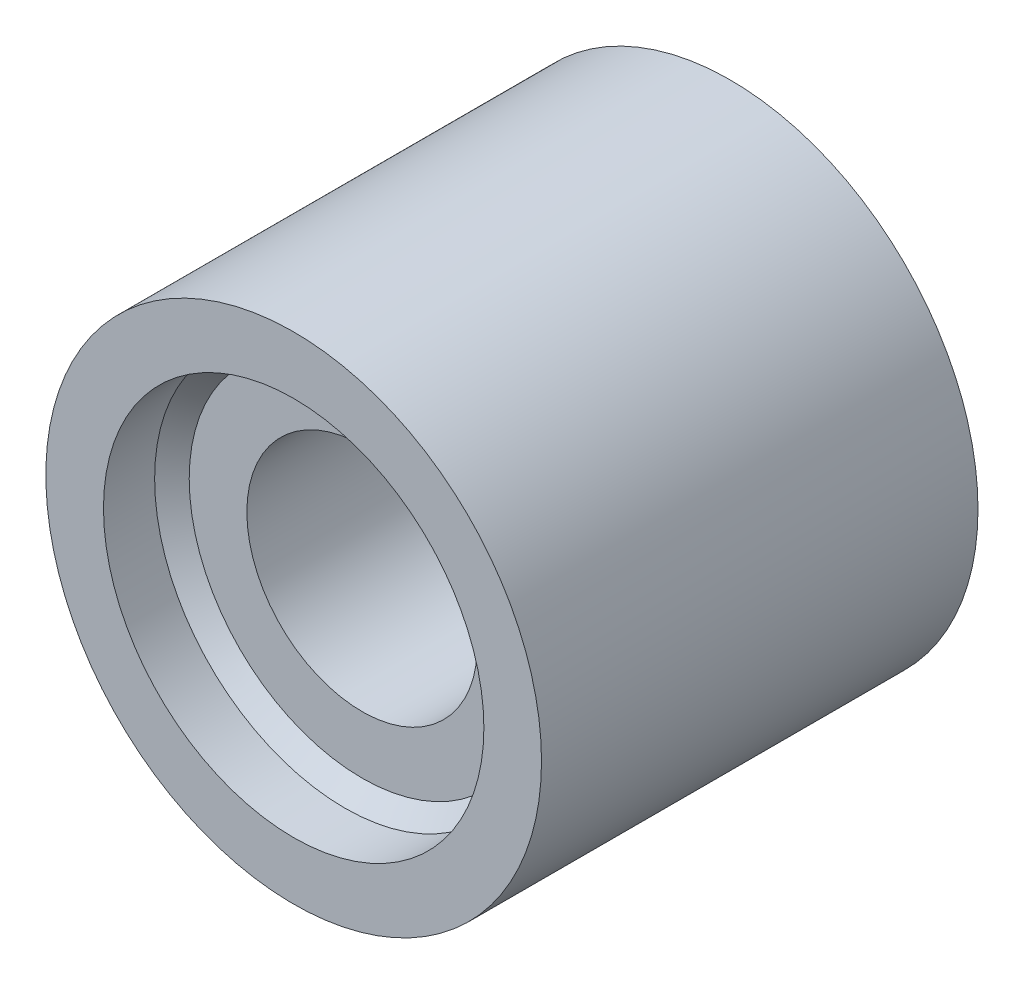
ISO-10303-21;
HEADER;
FILE_DESCRIPTION(('STEP AP214'),'2;1');
FILE_NAME('part.step','',(''),(''),'','','');
FILE_SCHEMA(('AUTOMOTIVE_DESIGN { 1 0 10303 214 1 1 1 1 }'));
ENDSEC;
DATA;
#1=APPLICATION_CONTEXT('core data for automotive mechanical design processes');
#2=APPLICATION_PROTOCOL_DEFINITION('international standard','automotive_design',2000,#1);
#3=PRODUCT_CONTEXT('',#1,'mechanical');
#4=PRODUCT('Part','Part','',(#3));
#5=PRODUCT_RELATED_PRODUCT_CATEGORY('part','',(#4));
#6=PRODUCT_DEFINITION_FORMATION('','',#4);
#7=PRODUCT_DEFINITION_CONTEXT('part definition',#1,'design');
#8=PRODUCT_DEFINITION('design','',#6,#7);
#9=PRODUCT_DEFINITION_SHAPE('','',#8);
#10=(LENGTH_UNIT() NAMED_UNIT(*) SI_UNIT(.MILLI.,.METRE.));
#11=(NAMED_UNIT(*) PLANE_ANGLE_UNIT() SI_UNIT($,.RADIAN.));
#12=(NAMED_UNIT(*) SI_UNIT($,.STERADIAN.) SOLID_ANGLE_UNIT());
#13=UNCERTAINTY_MEASURE_WITH_UNIT(LENGTH_MEASURE(1.E-05),#10,'distance_accuracy_value','');
#14=(GEOMETRIC_REPRESENTATION_CONTEXT(3) GLOBAL_UNCERTAINTY_ASSIGNED_CONTEXT((#13)) GLOBAL_UNIT_ASSIGNED_CONTEXT((#10,
#11,#12)) REPRESENTATION_CONTEXT('',''));
#15=CARTESIAN_POINT('',(0.,0.,0.));
#16=DIRECTION('',(0.,0.,1.));
#17=DIRECTION('',(1.,0.,0.));
#18=AXIS2_PLACEMENT_3D('',#15,#16,#17);
#19=CARTESIAN_POINT('',(0.,0.,9.61771));
#20=DIRECTION('',(0.,0.,-1.));
#21=DIRECTION('',(-1.,0.,0.));
#22=AXIS2_PLACEMENT_3D('',#19,#20,#21);
#23=CYLINDRICAL_SURFACE('',#22,8.382);
#24=CARTESIAN_POINT('',(0.,0.,-7.36346));
#25=DIRECTION('',(0.,0.,1.));
#26=DIRECTION('',(1.,0.,0.));
#27=AXIS2_PLACEMENT_3D('',#24,#25,#26);
#28=CIRCLE('',#27,8.382);
#29=CARTESIAN_POINT('',(8.382,0.,-7.36346));
#30=VERTEX_POINT('',#29);
#31=EDGE_CURVE('E59',#30,#30,#28,.T.);
#32=ORIENTED_EDGE('',*,*,#31,.T.);
#33=EDGE_LOOP('',(#32));
#34=FACE_BOUND('',#33,.T.);
#35=CARTESIAN_POINT('',(0.,0.,-9.61771));
#36=DIRECTION('',(0.,0.,1.));
#37=DIRECTION('',(1.,0.,0.));
#38=AXIS2_PLACEMENT_3D('',#35,#36,#37);
#39=CIRCLE('',#38,8.382);
#40=CARTESIAN_POINT('',(8.382,0.,-9.61771));
#41=VERTEX_POINT('',#40);
#42=EDGE_CURVE('E69',#41,#41,#39,.T.);
#43=ORIENTED_EDGE('',*,*,#42,.F.);
#44=EDGE_LOOP('',(#43));
#45=FACE_BOUND('',#44,.T.);
#46=ADVANCED_FACE('F43',(#34,#45),#23,.F.);
#47=CARTESIAN_POINT('',(0.,0.,7.36345999999999));
#48=DIRECTION('',(0.,0.,1.));
#49=DIRECTION('',(1.,0.,0.));
#50=AXIS2_PLACEMENT_3D('',#47,#48,#49);
#51=CIRCLE('',#50,8.382);
#52=CARTESIAN_POINT('',(8.382,0.,7.36345999999999));
#53=VERTEX_POINT('',#52);
#54=EDGE_CURVE('E10',#53,#53,#51,.F.);
#55=ORIENTED_EDGE('',*,*,#54,.T.);
#56=EDGE_LOOP('',(#55));
#57=FACE_BOUND('',#56,.T.);
#58=CARTESIAN_POINT('',(0.,0.,9.61771));
#59=DIRECTION('',(0.,0.,1.));
#60=DIRECTION('',(1.,0.,0.));
#61=AXIS2_PLACEMENT_3D('',#58,#59,#60);
#62=CIRCLE('',#61,8.382);
#63=CARTESIAN_POINT('',(8.382,0.,9.61771));
#64=VERTEX_POINT('',#63);
#65=EDGE_CURVE('E68',#64,#64,#62,.T.);
#66=ORIENTED_EDGE('',*,*,#65,.T.);
#67=EDGE_LOOP('',(#66));
#68=FACE_BOUND('',#67,.T.);
#69=ADVANCED_FACE('F101',(#57,#68),#23,.F.);
#70=CARTESIAN_POINT('',(0.,0.,9.61771));
#71=DIRECTION('',(0.,0.,-1.));
#72=DIRECTION('',(-1.,0.,0.));
#73=AXIS2_PLACEMENT_3D('',#70,#71,#72);
#74=CYLINDRICAL_SURFACE('',#73,10.922);
#75=CARTESIAN_POINT('',(0.,0.,9.61771));
#76=DIRECTION('',(0.,0.,1.));
#77=DIRECTION('',(1.,0.,0.));
#78=AXIS2_PLACEMENT_3D('',#75,#76,#77);
#79=CIRCLE('',#78,10.922);
#80=CARTESIAN_POINT('',(10.922,0.,9.61771));
#81=VERTEX_POINT('',#80);
#82=EDGE_CURVE('E64',#81,#81,#79,.T.);
#83=ORIENTED_EDGE('',*,*,#82,.F.);
#84=EDGE_LOOP('',(#83));
#85=FACE_BOUND('',#84,.T.);
#86=CARTESIAN_POINT('',(0.,0.,-9.61771));
#87=DIRECTION('',(0.,0.,1.));
#88=DIRECTION('',(1.,0.,0.));
#89=AXIS2_PLACEMENT_3D('',#86,#87,#88);
#90=CIRCLE('',#89,10.922);
#91=CARTESIAN_POINT('',(10.922,0.,-9.61771));
#92=VERTEX_POINT('',#91);
#93=EDGE_CURVE('E65',#92,#92,#90,.T.);
#94=ORIENTED_EDGE('',*,*,#93,.T.);
#95=EDGE_LOOP('',(#94));
#96=FACE_BOUND('',#95,.T.);
#97=ADVANCED_FACE('F106',(#85,#96),#74,.T.);
#98=CARTESIAN_POINT('',(0.,0.,9.61771));
#99=DIRECTION('',(0.,0.,1.));
#100=DIRECTION('',(1.,0.,0.));
#101=AXIS2_PLACEMENT_3D('',#98,#99,#100);
#102=PLANE('',#101);
#103=ORIENTED_EDGE('',*,*,#65,.F.);
#104=EDGE_LOOP('',(#103));
#105=FACE_BOUND('',#104,.T.);
#106=ORIENTED_EDGE('',*,*,#82,.T.);
#107=EDGE_LOOP('',(#106));
#108=FACE_BOUND('',#107,.T.);
#109=ADVANCED_FACE('F161',(#105,#108),#102,.T.);
#110=CARTESIAN_POINT('',(0.,0.,-9.61771));
#111=DIRECTION('',(0.,0.,1.));
#112=DIRECTION('',(1.,0.,0.));
#113=AXIS2_PLACEMENT_3D('',#110,#111,#112);
#114=PLANE('',#113);
#115=ORIENTED_EDGE('',*,*,#42,.T.);
#116=EDGE_LOOP('',(#115));
#117=FACE_BOUND('',#116,.T.);
#118=ORIENTED_EDGE('',*,*,#93,.F.);
#119=EDGE_LOOP('',(#118));
#120=FACE_BOUND('',#119,.T.);
#121=ADVANCED_FACE('F98',(#117,#120),#114,.F.);
#122=CARTESIAN_POINT('',(0.,0.,6.60146));
#123=DIRECTION('',(0.,0.,-1.));
#124=DIRECTION('',(-1.,0.,0.));
#125=AXIS2_PLACEMENT_3D('',#122,#123,#124);
#126=CYLINDRICAL_SURFACE('',#125,5.08);
#127=CARTESIAN_POINT('',(0.,0.,6.60146));
#128=DIRECTION('',(0.,0.,1.));
#129=DIRECTION('',(1.,0.,0.));
#130=AXIS2_PLACEMENT_3D('',#127,#128,#129);
#131=CIRCLE('',#130,5.08);
#132=CARTESIAN_POINT('',(-5.08,0.,6.60146));
#133=VERTEX_POINT('',#132);
#134=EDGE_CURVE('E72',#133,#133,#131,.T.);
#135=CARTESIAN_POINT('',(0.,0.,-6.60146));
#136=DIRECTION('',(0.,0.,1.));
#137=DIRECTION('',(1.,0.,0.));
#138=AXIS2_PLACEMENT_3D('',#135,#136,#137);
#139=CIRCLE('',#138,5.08);
#140=CARTESIAN_POINT('',(-5.08,0.,-6.60146));
#141=VERTEX_POINT('',#140);
#142=EDGE_CURVE('E77',#141,#141,#139,.T.);
#143=CARTESIAN_POINT('',(-5.08,0.,6.60146));
#144=CARTESIAN_POINT('',(-5.08,0.,6.46392958333333));
#145=CARTESIAN_POINT('',(-5.08,0.,6.32639916666667));
#146=CARTESIAN_POINT('',(-5.08,0.,6.05133833333333));
#147=CARTESIAN_POINT('',(-5.08,0.,5.91380791666667));
#148=CARTESIAN_POINT('',(-5.08,0.,5.63874708333333));
#149=CARTESIAN_POINT('',(-5.08,0.,5.50121666666667));
#150=CARTESIAN_POINT('',(-5.08,0.,5.22615583333333));
#151=CARTESIAN_POINT('',(-5.08,0.,5.08862541666667));
#152=CARTESIAN_POINT('',(-5.08,0.,4.81356458333333));
#153=CARTESIAN_POINT('',(-5.08,0.,4.67603416666667));
#154=CARTESIAN_POINT('',(-5.08,0.,4.40097333333333));
#155=CARTESIAN_POINT('',(-5.08,0.,4.26344291666667));
#156=CARTESIAN_POINT('',(-5.08,0.,3.98838208333333));
#157=CARTESIAN_POINT('',(-5.08,0.,3.85085166666667));
#158=CARTESIAN_POINT('',(-5.08,0.,3.57579083333333));
#159=CARTESIAN_POINT('',(-5.08,0.,3.43826041666667));
#160=CARTESIAN_POINT('',(-5.08,0.,3.16319958333333));
#161=CARTESIAN_POINT('',(-5.08,0.,3.02566916666667));
#162=CARTESIAN_POINT('',(-5.08,0.,2.75060833333333));
#163=CARTESIAN_POINT('',(-5.08,0.,2.61307791666667));
#164=CARTESIAN_POINT('',(-5.08,0.,2.33801708333333));
#165=CARTESIAN_POINT('',(-5.08,0.,2.20048666666667));
#166=CARTESIAN_POINT('',(-5.08,0.,1.92542583333333));
#167=CARTESIAN_POINT('',(-5.08,0.,1.78789541666667));
#168=CARTESIAN_POINT('',(-5.08,0.,1.51283458333333));
#169=CARTESIAN_POINT('',(-5.08,0.,1.37530416666667));
#170=CARTESIAN_POINT('',(-5.08,0.,1.10024333333333));
#171=CARTESIAN_POINT('',(-5.08,0.,0.962712916666666));
#172=CARTESIAN_POINT('',(-5.08,0.,0.687652083333333));
#173=CARTESIAN_POINT('',(-5.08,0.,0.550121666666666));
#174=CARTESIAN_POINT('',(-5.08,0.,0.275060833333333));
#175=CARTESIAN_POINT('',(-5.08,0.,0.137530416666666));
#176=CARTESIAN_POINT('',(-5.08,0.,-0.137530416666668));
#177=CARTESIAN_POINT('',(-5.08,0.,-0.275060833333334));
#178=CARTESIAN_POINT('',(-5.08,0.,-0.550121666666668));
#179=CARTESIAN_POINT('',(-5.08,0.,-0.687652083333335));
#180=CARTESIAN_POINT('',(-5.08,0.,-0.962712916666668));
#181=CARTESIAN_POINT('',(-5.08,0.,-1.10024333333333));
#182=CARTESIAN_POINT('',(-5.08,0.,-1.37530416666667));
#183=CARTESIAN_POINT('',(-5.08,0.,-1.51283458333333));
#184=CARTESIAN_POINT('',(-5.08,0.,-1.78789541666667));
#185=CARTESIAN_POINT('',(-5.08,0.,-1.92542583333333));
#186=CARTESIAN_POINT('',(-5.08,0.,-2.20048666666667));
#187=CARTESIAN_POINT('',(-5.08,0.,-2.33801708333333));
#188=CARTESIAN_POINT('',(-5.08,0.,-2.61307791666667));
#189=CARTESIAN_POINT('',(-5.08,0.,-2.75060833333333));
#190=CARTESIAN_POINT('',(-5.08,0.,-3.02566916666667));
#191=CARTESIAN_POINT('',(-5.08,0.,-3.16319958333333));
#192=CARTESIAN_POINT('',(-5.08,0.,-3.43826041666667));
#193=CARTESIAN_POINT('',(-5.08,0.,-3.57579083333333));
#194=CARTESIAN_POINT('',(-5.08,0.,-3.85085166666667));
#195=CARTESIAN_POINT('',(-5.08,0.,-3.98838208333333));
#196=CARTESIAN_POINT('',(-5.08,0.,-4.26344291666667));
#197=CARTESIAN_POINT('',(-5.08,0.,-4.40097333333333));
#198=CARTESIAN_POINT('',(-5.08,0.,-4.67603416666667));
#199=CARTESIAN_POINT('',(-5.08,0.,-4.81356458333333));
#200=CARTESIAN_POINT('',(-5.08,0.,-5.08862541666667));
#201=CARTESIAN_POINT('',(-5.08,0.,-5.22615583333333));
#202=CARTESIAN_POINT('',(-5.08,0.,-5.50121666666667));
#203=CARTESIAN_POINT('',(-5.08,0.,-5.63874708333333));
#204=CARTESIAN_POINT('',(-5.08,0.,-5.91380791666667));
#205=CARTESIAN_POINT('',(-5.08,0.,-6.05133833333333));
#206=CARTESIAN_POINT('',(-5.08,0.,-6.32639916666667));
#207=CARTESIAN_POINT('',(-5.08,0.,-6.46392958333333));
#208=CARTESIAN_POINT('',(-5.08,0.,-6.60146));
#209=B_SPLINE_CURVE_WITH_KNOTS('',3,(#143,#144,#145,#146,#147,#148,#149,#150,#151,#152,#153,
#154,#155,#156,#157,#158,#159,#160,#161,#162,#163,#164,#165,#166,#167,#168,#169,#170,#171,#172,
#173,#174,#175,#176,#177,#178,#179,#180,#181,#182,#183,#184,#185,#186,#187,#188,#189,#190,#191,
#192,#193,#194,#195,#196,#197,#198,#199,#200,#201,#202,#203,#204,#205,#206,#207,#208),
.UNSPECIFIED.,.F.,.F.,(4,2,2,2,2,2,2,2,2,2,2,2,2,2,2,2,2,2,2,2,2,2,2,2,2,2,2,2,2,2,2,2,4),(0.,
0.41259125,0.8251825,1.23777375,1.650365,2.06295625,2.4755475,2.88813875,3.30073,3.71332125,
4.1259125,4.53850375,4.951095,5.36368625,5.7762775,6.18886875,6.60146,7.01405125,7.4266425,
7.83923375,8.251825,8.66441625,9.0770075,9.48959875,9.90219,10.31478125,10.7273725,11.13996375,
11.552555,11.96514625,12.3777375,12.79032875,13.20292),.UNSPECIFIED.);
#210=EDGE_CURVE('BSEAM83',#133,#141,#209,.T.);
#211=ORIENTED_EDGE('',*,*,#134,.T.);
#212=ORIENTED_EDGE('',*,*,#142,.F.);
#213=ORIENTED_EDGE('',*,*,#210,.T.);
#214=ORIENTED_EDGE('',*,*,#210,.F.);
#215=EDGE_LOOP('',(#211,#213,#212,#214));
#216=FACE_BOUND('',#215,.T.);
#217=ADVANCED_FACE('F83',(#216),#126,.F.);
#218=CARTESIAN_POINT('',(0.,0.,6.60146));
#219=DIRECTION('',(0.,0.,1.));
#220=DIRECTION('',(1.,0.,0.));
#221=AXIS2_PLACEMENT_3D('',#218,#219,#220);
#222=PLANE('',#221);
#223=CARTESIAN_POINT('',(0.,0.,6.60146));
#224=DIRECTION('',(0.,0.,1.));
#225=DIRECTION('',(1.,0.,0.));
#226=AXIS2_PLACEMENT_3D('',#223,#224,#225);
#227=CIRCLE('',#226,7.62000000000001);
#228=CARTESIAN_POINT('',(7.62,0.,6.60146));
#229=VERTEX_POINT('',#228);
#230=EDGE_CURVE('E51',#229,#229,#227,.T.);
#231=ORIENTED_EDGE('',*,*,#230,.T.);
#232=EDGE_LOOP('',(#231));
#233=FACE_BOUND('',#232,.T.);
#234=ORIENTED_EDGE('',*,*,#134,.F.);
#235=EDGE_LOOP('',(#234));
#236=FACE_BOUND('',#235,.T.);
#237=ADVANCED_FACE('F86',(#233,#236),#222,.T.);
#238=CARTESIAN_POINT('',(0.,0.,-6.60146));
#239=DIRECTION('',(0.,0.,1.));
#240=DIRECTION('',(1.,0.,0.));
#241=AXIS2_PLACEMENT_3D('',#238,#239,#240);
#242=PLANE('',#241);
#243=CARTESIAN_POINT('',(0.,0.,-6.60146));
#244=DIRECTION('',(0.,0.,1.));
#245=DIRECTION('',(1.,0.,0.));
#246=AXIS2_PLACEMENT_3D('',#243,#244,#245);
#247=CIRCLE('',#246,7.62000000000001);
#248=CARTESIAN_POINT('',(7.62000000000001,0.,-6.60146));
#249=VERTEX_POINT('',#248);
#250=EDGE_CURVE('E55',#249,#249,#247,.F.);
#251=ORIENTED_EDGE('',*,*,#250,.T.);
#252=EDGE_LOOP('',(#251));
#253=FACE_BOUND('',#252,.T.);
#254=ORIENTED_EDGE('',*,*,#142,.T.);
#255=EDGE_LOOP('',(#254));
#256=FACE_BOUND('',#255,.T.);
#257=ADVANCED_FACE('F88',(#253,#256),#242,.F.);
#258=CARTESIAN_POINT('',(0.,0.,-7.36346));
#259=DIRECTION('',(0.,0.,-1.));
#260=DIRECTION('',(-1.,0.,0.));
#261=AXIS2_PLACEMENT_3D('',#258,#259,#260);
#262=CONICAL_SURFACE('',#261,8.382,0.785398163397444);
#263=ORIENTED_EDGE('',*,*,#250,.F.);
#264=EDGE_LOOP('',(#263));
#265=FACE_BOUND('',#264,.T.);
#266=ORIENTED_EDGE('',*,*,#31,.F.);
#267=EDGE_LOOP('',(#266));
#268=FACE_BOUND('',#267,.T.);
#269=ADVANCED_FACE('F94',(#265,#268),#262,.F.);
#270=CARTESIAN_POINT('',(0.,0.,6.60146));
#271=DIRECTION('',(0.,0.,1.));
#272=DIRECTION('',(1.,0.,0.));
#273=AXIS2_PLACEMENT_3D('',#270,#271,#272);
#274=CONICAL_SURFACE('',#273,7.62000000000001,0.785398163397454);
#275=CARTESIAN_POINT('',(8.382,0.,7.36345999999999));
#276=CARTESIAN_POINT('',(8.3740625,0.,7.35552249999999));
#277=CARTESIAN_POINT('',(8.366125,0.,7.34758499999999));
#278=CARTESIAN_POINT('',(8.35025,0.,7.33170999999999));
#279=CARTESIAN_POINT('',(8.3423125,0.,7.32377249999999));
#280=CARTESIAN_POINT('',(8.3264375,0.,7.30789749999999));
#281=CARTESIAN_POINT('',(8.3185,0.,7.29995999999999));
#282=CARTESIAN_POINT('',(8.302625,0.,7.28408499999999));
#283=CARTESIAN_POINT('',(8.2946875,0.,7.27614749999999));
#284=CARTESIAN_POINT('',(8.2788125,0.,7.26027249999999));
#285=CARTESIAN_POINT('',(8.270875,0.,7.25233499999999));
#286=CARTESIAN_POINT('',(8.255,0.,7.23645999999999));
#287=CARTESIAN_POINT('',(8.2470625,0.,7.22852249999999));
#288=CARTESIAN_POINT('',(8.2311875,0.,7.21264749999999));
#289=CARTESIAN_POINT('',(8.22325,0.,7.20470999999999));
#290=CARTESIAN_POINT('',(8.207375,0.,7.18883499999999));
#291=CARTESIAN_POINT('',(8.1994375,0.,7.18089749999999));
#292=CARTESIAN_POINT('',(8.1835625,0.,7.16502249999999));
#293=CARTESIAN_POINT('',(8.175625,0.,7.15708499999999));
#294=CARTESIAN_POINT('',(8.15975,0.,7.14120999999999));
#295=CARTESIAN_POINT('',(8.1518125,0.,7.13327249999999));
#296=CARTESIAN_POINT('',(8.1359375,0.,7.11739749999999));
#297=CARTESIAN_POINT('',(8.128,0.,7.10945999999999));
#298=CARTESIAN_POINT('',(8.112125,0.,7.09358499999999));
#299=CARTESIAN_POINT('',(8.1041875,0.,7.08564749999999));
#300=CARTESIAN_POINT('',(8.0883125,0.,7.06977249999999));
#301=CARTESIAN_POINT('',(8.080375,0.,7.06183499999999));
#302=CARTESIAN_POINT('',(8.0645,0.,7.04595999999999));
#303=CARTESIAN_POINT('',(8.0565625,0.,7.03802249999999));
#304=CARTESIAN_POINT('',(8.0406875,0.,7.02214749999999));
#305=CARTESIAN_POINT('',(8.03275,0.,7.01420999999999));
#306=CARTESIAN_POINT('',(8.016875,0.,6.99833499999999));
#307=CARTESIAN_POINT('',(8.0089375,0.,6.99039749999999));
#308=CARTESIAN_POINT('',(7.9930625,0.,6.97452249999999));
#309=CARTESIAN_POINT('',(7.985125,0.,6.96658499999999));
#310=CARTESIAN_POINT('',(7.96925,0.,6.95070999999999));
#311=CARTESIAN_POINT('',(7.9613125,0.,6.94277249999999));
#312=CARTESIAN_POINT('',(7.9454375,0.,6.92689749999999));
#313=CARTESIAN_POINT('',(7.9375,0.,6.91895999999999));
#314=CARTESIAN_POINT('',(7.921625,0.,6.90308499999999));
#315=CARTESIAN_POINT('',(7.9136875,0.,6.89514749999999));
#316=CARTESIAN_POINT('',(7.8978125,0.,6.87927249999999));
#317=CARTESIAN_POINT('',(7.889875,0.,6.87133499999999));
#318=CARTESIAN_POINT('',(7.874,0.,6.85545999999999));
#319=CARTESIAN_POINT('',(7.8660625,0.,6.84752249999999));
#320=CARTESIAN_POINT('',(7.8501875,0.,6.8316475));
#321=CARTESIAN_POINT('',(7.84225,0.,6.82371));
#322=CARTESIAN_POINT('',(7.826375,0.,6.807835));
#323=CARTESIAN_POINT('',(7.8184375,0.,6.7998975));
#324=CARTESIAN_POINT('',(7.8025625,0.,6.7840225));
#325=CARTESIAN_POINT('',(7.794625,0.,6.776085));
#326=CARTESIAN_POINT('',(7.77875,0.,6.76021));
#327=CARTESIAN_POINT('',(7.7708125,0.,6.7522725));
#328=CARTESIAN_POINT('',(7.7549375,0.,6.7363975));
#329=CARTESIAN_POINT('',(7.747,0.,6.72846));
#330=CARTESIAN_POINT('',(7.731125,0.,6.712585));
#331=CARTESIAN_POINT('',(7.7231875,0.,6.7046475));
#332=CARTESIAN_POINT('',(7.7073125,0.,6.6887725));
#333=CARTESIAN_POINT('',(7.69937500000001,0.,6.680835));
#334=CARTESIAN_POINT('',(7.6835,0.,6.66496));
#335=CARTESIAN_POINT('',(7.6755625,0.,6.6570225));
#336=CARTESIAN_POINT('',(7.6596875,0.,6.6411475));
#337=CARTESIAN_POINT('',(7.65175000000001,0.,6.63321));
#338=CARTESIAN_POINT('',(7.635875,0.,6.617335));
#339=CARTESIAN_POINT('',(7.62793750000001,0.,6.6093975));
#340=CARTESIAN_POINT('',(7.62,0.,6.60146));
#341=B_SPLINE_CURVE_WITH_KNOTS('',3,(#275,#276,#277,#278,#279,#280,#281,#282,#283,#284,#285,
#286,#287,#288,#289,#290,#291,#292,#293,#294,#295,#296,#297,#298,#299,#300,#301,#302,#303,#304,
#305,#306,#307,#308,#309,#310,#311,#312,#313,#314,#315,#316,#317,#318,#319,#320,#321,#322,#323,
#324,#325,#326,#327,#328,#329,#330,#331,#332,#333,#334,#335,#336,#337,#338,#339,#340),
.UNSPECIFIED.,.F.,.F.,(4,2,2,2,2,2,2,2,2,2,2,2,2,2,2,2,2,2,2,2,2,2,2,2,2,2,2,2,2,2,2,2,4),(0.,
0.0336759604540087,0.0673519209080185,0.101027881362027,0.134703841816036,0.168379802270045,
0.202055762724053,0.235731723178063,0.269407683632072,0.30308364408608,0.336759604540089,
0.370435564994098,0.404111525448108,0.437787485902116,0.471463446356125,0.505139406810134,
0.538815367264143,0.572491327718151,0.606167288172161,0.63984324862617,0.673519209080179,
0.707195169534187,0.740871129988196,0.774547090442206,0.808223050896215,0.841899011350223,
0.875574971804232,0.909250932258241,0.94292689271225,0.976602853166259,1.01027881362027,
1.04395477407428,1.07763073452829),.UNSPECIFIED.);
#342=EDGE_CURVE('BSEAM46',#53,#229,#341,.T.);
#343=ORIENTED_EDGE('',*,*,#54,.F.);
#344=ORIENTED_EDGE('',*,*,#230,.F.);
#345=ORIENTED_EDGE('',*,*,#342,.T.);
#346=ORIENTED_EDGE('',*,*,#342,.F.);
#347=EDGE_LOOP('',(#343,#345,#344,#346));
#348=FACE_BOUND('',#347,.T.);
#349=ADVANCED_FACE('F46',(#348),#274,.F.);
#350=CLOSED_SHELL('',(#46,#69,#97,#109,#121,#217,#237,#257,#269,#349));
#351=MANIFOLD_SOLID_BREP('B2',#350);
#352=ADVANCED_BREP_SHAPE_REPRESENTATION('',(#18,#351),#14);
#353=SHAPE_DEFINITION_REPRESENTATION(#9,#352);
ENDSEC;
END-ISO-10303-21;
